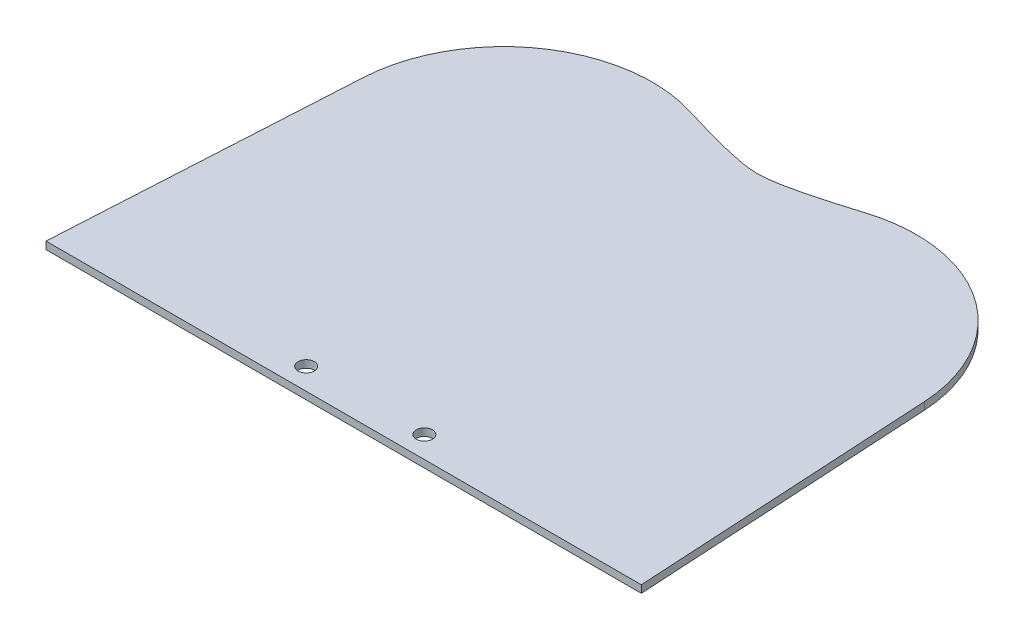
ISO-10303-21;
HEADER;
FILE_DESCRIPTION(('STEP AP214'),'2;1');
FILE_NAME('part.step','',(''),(''),'','','');
FILE_SCHEMA(('AUTOMOTIVE_DESIGN { 1 0 10303 214 1 1 1 1 }'));
ENDSEC;
DATA;
#1=APPLICATION_CONTEXT('core data for automotive mechanical design processes');
#2=APPLICATION_PROTOCOL_DEFINITION('international standard','automotive_design',2000,#1);
#3=PRODUCT_CONTEXT('',#1,'mechanical');
#4=PRODUCT('Part','Part','',(#3));
#5=PRODUCT_RELATED_PRODUCT_CATEGORY('part','',(#4));
#6=PRODUCT_DEFINITION_FORMATION('','',#4);
#7=PRODUCT_DEFINITION_CONTEXT('part definition',#1,'design');
#8=PRODUCT_DEFINITION('design','',#6,#7);
#9=PRODUCT_DEFINITION_SHAPE('','',#8);
#10=(LENGTH_UNIT() NAMED_UNIT(*) SI_UNIT(.MILLI.,.METRE.));
#11=(NAMED_UNIT(*) PLANE_ANGLE_UNIT() SI_UNIT($,.RADIAN.));
#12=(NAMED_UNIT(*) SI_UNIT($,.STERADIAN.) SOLID_ANGLE_UNIT());
#13=UNCERTAINTY_MEASURE_WITH_UNIT(LENGTH_MEASURE(1.E-05),#10,'distance_accuracy_value','');
#14=(GEOMETRIC_REPRESENTATION_CONTEXT(3) GLOBAL_UNCERTAINTY_ASSIGNED_CONTEXT((#13)) GLOBAL_UNIT_ASSIGNED_CONTEXT((#10,
#11,#12)) REPRESENTATION_CONTEXT('',''));
#15=CARTESIAN_POINT('',(0.,0.,0.));
#16=DIRECTION('',(0.,0.,1.));
#17=DIRECTION('',(1.,0.,0.));
#18=AXIS2_PLACEMENT_3D('',#15,#16,#17);
#19=CARTESIAN_POINT('',(0.,2.,0.));
#20=DIRECTION('',(0.,0.,-1.));
#21=DIRECTION('',(-1.,0.,0.));
#22=AXIS2_PLACEMENT_3D('',#19,#20,#21);
#23=PLANE('',#22);
#24=DIRECTION('',(1.,0.,0.));
#25=VECTOR('',#24,1.);
#26=CARTESIAN_POINT('',(0.,0.,0.));
#27=LINE('',#26,#25);
#28=CARTESIAN_POINT('',(0.,0.,0.));
#29=VERTEX_POINT('',#28);
#30=CARTESIAN_POINT('',(160.,0.,0.));
#31=VERTEX_POINT('',#30);
#32=EDGE_CURVE('E100',#29,#31,#27,.T.);
#33=ORIENTED_EDGE('',*,*,#32,.T.);
#34=DIRECTION('',(0.,-1.,0.));
#35=VECTOR('',#34,1.);
#36=CARTESIAN_POINT('',(160.,2.,0.));
#37=LINE('',#36,#35);
#38=CARTESIAN_POINT('',(160.,2.,0.));
#39=VERTEX_POINT('',#38);
#40=EDGE_CURVE('E41',#39,#31,#37,.T.);
#41=ORIENTED_EDGE('',*,*,#40,.F.);
#42=DIRECTION('',(1.,0.,0.));
#43=VECTOR('',#42,1.);
#44=CARTESIAN_POINT('',(0.,2.,0.));
#45=LINE('',#44,#43);
#46=CARTESIAN_POINT('',(0.,2.,0.));
#47=VERTEX_POINT('',#46);
#48=EDGE_CURVE('E106',#47,#39,#45,.T.);
#49=ORIENTED_EDGE('',*,*,#48,.F.);
#50=DIRECTION('',(0.,-1.,0.));
#51=VECTOR('',#50,1.);
#52=CARTESIAN_POINT('',(0.,2.,0.));
#53=LINE('',#52,#51);
#54=EDGE_CURVE('E11',#47,#29,#53,.T.);
#55=ORIENTED_EDGE('',*,*,#54,.T.);
#56=EDGE_LOOP('',(#33,#41,#49,#55));
#57=FACE_BOUND('',#56,.T.);
#58=ADVANCED_FACE('F34',(#57),#23,.F.);
#59=CARTESIAN_POINT('',(0.,2.,0.));
#60=DIRECTION('',(0.,-1.,0.));
#61=DIRECTION('',(0.,0.,-1.));
#62=AXIS2_PLACEMENT_3D('',#59,#60,#61);
#63=PLANE('',#62);
#64=CARTESIAN_POINT('',(64.12,2.,-5.81));
#65=DIRECTION('',(0.,1.,0.));
#66=DIRECTION('',(0.,0.,1.));
#67=AXIS2_PLACEMENT_3D('',#64,#65,#66);
#68=CIRCLE('',#67,2.185);
#69=CARTESIAN_POINT('',(64.12,2.,-3.625));
#70=VERTEX_POINT('',#69);
#71=EDGE_CURVE('E121',#70,#70,#68,.T.);
#72=ORIENTED_EDGE('',*,*,#71,.F.);
#73=EDGE_LOOP('',(#72));
#74=FACE_BOUND('',#73,.T.);
#75=CARTESIAN_POINT('',(95.87,2.,-5.81));
#76=DIRECTION('',(0.,1.,0.));
#77=DIRECTION('',(0.,0.,1.));
#78=AXIS2_PLACEMENT_3D('',#75,#76,#77);
#79=CIRCLE('',#78,2.185);
#80=CARTESIAN_POINT('',(95.87,2.,-3.625));
#81=VERTEX_POINT('',#80);
#82=EDGE_CURVE('E115',#81,#81,#79,.T.);
#83=ORIENTED_EDGE('',*,*,#82,.F.);
#84=EDGE_LOOP('',(#83));
#85=FACE_BOUND('',#84,.T.);
#86=CARTESIAN_POINT('',(44.5206222699094,2.,-78.48676821735));
#87=DIRECTION('',(0.,-1.,0.));
#88=DIRECTION('',(0.,0.,-1.));
#89=AXIS2_PLACEMENT_3D('',#86,#87,#88);
#90=CIRCLE('',#89,40.);
#91=CARTESIAN_POINT('',(4.58493819976732,2.,-80.7541759552303));
#92=VERTEX_POINT('',#91);
#93=CARTESIAN_POINT('',(56.3933458143429,2.,-116.684129849241));
#94=VERTEX_POINT('',#93);
#95=EDGE_CURVE('E252',#92,#94,#90,.T.);
#96=ORIENTED_EDGE('',*,*,#95,.F.);
#97=DIRECTION('',(0.0566851934470067,0.,-0.998392101753552));
#98=VECTOR('',#97,1.);
#99=CARTESIAN_POINT('',(0.,2.,0.));
#100=LINE('',#99,#98);
#101=EDGE_CURVE('E258',#47,#92,#100,.T.);
#102=ORIENTED_EDGE('',*,*,#101,.F.);
#103=ORIENTED_EDGE('',*,*,#48,.T.);
#104=DIRECTION('',(0.0566851934470067,0.,0.998392101753552));
#105=VECTOR('',#104,1.);
#106=CARTESIAN_POINT('',(160.,2.,0.));
#107=LINE('',#106,#105);
#108=CARTESIAN_POINT('',(155.415061800233,2.,-80.7541759552303));
#109=VERTEX_POINT('',#108);
#110=EDGE_CURVE('E53',#109,#39,#107,.T.);
#111=ORIENTED_EDGE('',*,*,#110,.F.);
#112=CARTESIAN_POINT('',(115.479377730091,2.,-78.48676821735));
#113=DIRECTION('',(0.,-1.,0.));
#114=DIRECTION('',(0.,0.,1.));
#115=AXIS2_PLACEMENT_3D('',#112,#113,#114);
#116=CIRCLE('',#115,40.);
#117=CARTESIAN_POINT('',(103.606654185657,2.,-116.684129849241));
#118=VERTEX_POINT('',#117);
#119=EDGE_CURVE('E231',#118,#109,#116,.T.);
#120=ORIENTED_EDGE('',*,*,#119,.F.);
#121=CARTESIAN_POINT('',(80.,2.,-111.276722040985));
#122=CARTESIAN_POINT('',(86.2097434625132,2.,-111.276722040985));
#123=CARTESIAN_POINT('',(103.606654185657,2.,-116.684129849241));
#124=B_SPLINE_CURVE_WITH_KNOTS('',2,(#121,#122,#123),.UNSPECIFIED.,.F.,.F.,(3,3),(0.,1.),.UNSPECIFIED.);
#125=CARTESIAN_POINT('',(80.,2.,-111.276722040985));
#126=VERTEX_POINT('',#125);
#127=EDGE_CURVE('E236',#126,#118,#124,.T.);
#128=ORIENTED_EDGE('',*,*,#127,.F.);
#129=CARTESIAN_POINT('',(56.3933458143429,2.,-116.684129849241));
#130=CARTESIAN_POINT('',(73.7902565374868,2.,-111.276722040985));
#131=CARTESIAN_POINT('',(80.,2.,-111.276722040985));
#132=B_SPLINE_CURVE_WITH_KNOTS('',2,(#129,#130,#131),.UNSPECIFIED.,.F.,.F.,(3,3),(0.,1.),.UNSPECIFIED.);
#133=EDGE_CURVE('E244',#94,#126,#132,.T.);
#134=ORIENTED_EDGE('',*,*,#133,.F.);
#135=EDGE_LOOP('',(#96,#102,#103,#111,#120,#128,#134));
#136=FACE_BOUND('',#135,.T.);
#137=ADVANCED_FACE('F157',(#74,#85,#136),#63,.F.);
#138=CARTESIAN_POINT('',(0.,0.,0.));
#139=DIRECTION('',(0.,-1.,0.));
#140=DIRECTION('',(0.,0.,-1.));
#141=AXIS2_PLACEMENT_3D('',#138,#139,#140);
#142=PLANE('',#141);
#143=DIRECTION('',(0.0566851934470067,0.,-0.998392101753552));
#144=VECTOR('',#143,1.);
#145=CARTESIAN_POINT('',(0.,0.,0.));
#146=LINE('',#145,#144);
#147=CARTESIAN_POINT('',(4.58493819976732,0.,-80.7541759552303));
#148=VERTEX_POINT('',#147);
#149=EDGE_CURVE('E90',#29,#148,#146,.T.);
#150=ORIENTED_EDGE('',*,*,#149,.T.);
#151=CARTESIAN_POINT('',(44.5206222699094,0.,-78.48676821735));
#152=DIRECTION('',(0.,-1.,0.));
#153=DIRECTION('',(0.,0.,-1.));
#154=AXIS2_PLACEMENT_3D('',#151,#152,#153);
#155=CIRCLE('',#154,40.);
#156=CARTESIAN_POINT('',(56.3933458143429,0.,-116.684129849241));
#157=VERTEX_POINT('',#156);
#158=EDGE_CURVE('E277',#148,#157,#155,.T.);
#159=ORIENTED_EDGE('',*,*,#158,.T.);
#160=CARTESIAN_POINT('',(56.3933458143429,0.,-116.684129849241));
#161=CARTESIAN_POINT('',(73.7902565374868,0.,-111.276722040985));
#162=CARTESIAN_POINT('',(80.,0.,-111.276722040985));
#163=B_SPLINE_CURVE_WITH_KNOTS('',2,(#160,#161,#162),.UNSPECIFIED.,.F.,.F.,(3,3),(0.,1.),.UNSPECIFIED.);
#164=CARTESIAN_POINT('',(80.,0.,-111.276722040985));
#165=VERTEX_POINT('',#164);
#166=EDGE_CURVE('E268',#157,#165,#163,.T.);
#167=ORIENTED_EDGE('',*,*,#166,.T.);
#168=CARTESIAN_POINT('',(80.,0.,-111.276722040985));
#169=CARTESIAN_POINT('',(86.2097434625132,0.,-111.276722040985));
#170=CARTESIAN_POINT('',(103.606654185657,0.,-116.684129849241));
#171=B_SPLINE_CURVE_WITH_KNOTS('',2,(#168,#169,#170),.UNSPECIFIED.,.F.,.F.,(3,3),(0.,1.),.UNSPECIFIED.);
#172=CARTESIAN_POINT('',(103.606654185657,0.,-116.684129849241));
#173=VERTEX_POINT('',#172);
#174=EDGE_CURVE('E262',#165,#173,#171,.T.);
#175=ORIENTED_EDGE('',*,*,#174,.T.);
#176=CARTESIAN_POINT('',(115.479377730091,0.,-78.48676821735));
#177=DIRECTION('',(0.,-1.,0.));
#178=DIRECTION('',(0.,0.,-1.));
#179=AXIS2_PLACEMENT_3D('',#176,#177,#178);
#180=CIRCLE('',#179,40.);
#181=CARTESIAN_POINT('',(155.415061800233,0.,-80.7541759552303));
#182=VERTEX_POINT('',#181);
#183=EDGE_CURVE('E228',#173,#182,#180,.T.);
#184=ORIENTED_EDGE('',*,*,#183,.T.);
#185=DIRECTION('',(0.0566851934470067,0.,0.998392101753552));
#186=VECTOR('',#185,1.);
#187=CARTESIAN_POINT('',(160.,0.,0.));
#188=LINE('',#187,#186);
#189=EDGE_CURVE('E104',#182,#31,#188,.T.);
#190=ORIENTED_EDGE('',*,*,#189,.T.);
#191=ORIENTED_EDGE('',*,*,#32,.F.);
#192=EDGE_LOOP('',(#150,#159,#167,#175,#184,#190,#191));
#193=FACE_BOUND('',#192,.T.);
#194=CARTESIAN_POINT('',(64.12,0.,-5.81));
#195=DIRECTION('',(0.,-1.,0.));
#196=DIRECTION('',(0.,0.,-1.));
#197=AXIS2_PLACEMENT_3D('',#194,#195,#196);
#198=CIRCLE('',#197,2.185);
#199=CARTESIAN_POINT('',(64.12,0.,-7.99499999999999));
#200=VERTEX_POINT('',#199);
#201=EDGE_CURVE('E118',#200,#200,#198,.F.);
#202=ORIENTED_EDGE('',*,*,#201,.T.);
#203=EDGE_LOOP('',(#202));
#204=FACE_BOUND('',#203,.T.);
#205=CARTESIAN_POINT('',(95.87,0.,-5.81));
#206=DIRECTION('',(0.,-1.,0.));
#207=DIRECTION('',(0.,0.,-1.));
#208=AXIS2_PLACEMENT_3D('',#205,#206,#207);
#209=CIRCLE('',#208,2.185);
#210=CARTESIAN_POINT('',(95.87,0.,-7.99499999999999));
#211=VERTEX_POINT('',#210);
#212=EDGE_CURVE('E107',#211,#211,#209,.F.);
#213=ORIENTED_EDGE('',*,*,#212,.T.);
#214=EDGE_LOOP('',(#213));
#215=FACE_BOUND('',#214,.T.);
#216=ADVANCED_FACE('F101',(#193,#204,#215),#142,.T.);
#217=CARTESIAN_POINT('',(95.87,-6.18011326757041,-5.81));
#218=DIRECTION('',(0.,1.,0.));
#219=DIRECTION('',(0.,0.,1.));
#220=AXIS2_PLACEMENT_3D('',#217,#218,#219);
#221=CYLINDRICAL_SURFACE('',#220,2.185);
#222=ORIENTED_EDGE('',*,*,#82,.T.);
#223=EDGE_LOOP('',(#222));
#224=FACE_BOUND('',#223,.T.);
#225=ORIENTED_EDGE('',*,*,#212,.F.);
#226=EDGE_LOOP('',(#225));
#227=FACE_BOUND('',#226,.T.);
#228=ADVANCED_FACE('F152',(#224,#227),#221,.F.);
#229=CARTESIAN_POINT('',(64.12,-6.18011326757041,-5.81));
#230=DIRECTION('',(0.,1.,0.));
#231=DIRECTION('',(0.,0.,1.));
#232=AXIS2_PLACEMENT_3D('',#229,#230,#231);
#233=CYLINDRICAL_SURFACE('',#232,2.185);
#234=ORIENTED_EDGE('',*,*,#71,.T.);
#235=EDGE_LOOP('',(#234));
#236=FACE_BOUND('',#235,.T.);
#237=ORIENTED_EDGE('',*,*,#201,.F.);
#238=EDGE_LOOP('',(#237));
#239=FACE_BOUND('',#238,.T.);
#240=ADVANCED_FACE('F149',(#236,#239),#233,.F.);
#241=CARTESIAN_POINT('',(0.,-209.220997100423,0.));
#242=DIRECTION('',(0.998392101753552,0.,0.0566851934470067));
#243=DIRECTION('',(0.0566851934470067,0.,-0.998392101753552));
#244=AXIS2_PLACEMENT_3D('',#241,#242,#243);
#245=PLANE('',#244);
#246=ORIENTED_EDGE('',*,*,#54,.F.);
#247=ORIENTED_EDGE('',*,*,#101,.T.);
#248=DIRECTION('',(0.,1.,0.));
#249=VECTOR('',#248,1.);
#250=CARTESIAN_POINT('',(4.58493819976732,-209.220997100423,-80.7541759552303));
#251=LINE('',#250,#249);
#252=EDGE_CURVE('E95',#148,#92,#251,.T.);
#253=ORIENTED_EDGE('',*,*,#252,.F.);
#254=ORIENTED_EDGE('',*,*,#149,.F.);
#255=EDGE_LOOP('',(#246,#247,#253,#254));
#256=FACE_BOUND('',#255,.T.);
#257=ADVANCED_FACE('F92',(#256),#245,.F.);
#258=CARTESIAN_POINT('',(44.5206222699094,-209.220997100423,-78.48676821735));
#259=DIRECTION('',(0.,1.,0.));
#260=DIRECTION('',(0.,0.,1.));
#261=AXIS2_PLACEMENT_3D('',#258,#259,#260);
#262=CYLINDRICAL_SURFACE('',#261,40.);
#263=ORIENTED_EDGE('',*,*,#252,.T.);
#264=ORIENTED_EDGE('',*,*,#95,.T.);
#265=DIRECTION('',(0.,1.,0.));
#266=VECTOR('',#265,1.);
#267=CARTESIAN_POINT('',(56.3933458143429,-209.220997100423,-116.684129849241));
#268=LINE('',#267,#266);
#269=EDGE_CURVE('E276',#157,#94,#268,.T.);
#270=ORIENTED_EDGE('',*,*,#269,.F.);
#271=ORIENTED_EDGE('',*,*,#158,.F.);
#272=EDGE_LOOP('',(#263,#264,#270,#271));
#273=FACE_BOUND('',#272,.T.);
#274=ADVANCED_FACE('F141',(#273),#262,.T.);
#275=CARTESIAN_POINT('',(56.3933458143429,-209.220997100423,-116.684129849241));
#276=CARTESIAN_POINT('',(73.7902565374868,-209.220997100423,-111.276722040985));
#277=CARTESIAN_POINT('',(80.,-209.220997100423,-111.276722040985));
#278=B_SPLINE_CURVE_WITH_KNOTS('',2,(#275,#276,#277),.UNSPECIFIED.,.F.,.F.,(3,3),(0.,1.),.UNSPECIFIED.);
#279=DIRECTION('',(0.,1.,0.));
#280=VECTOR('',#279,1.);
#281=SURFACE_OF_LINEAR_EXTRUSION('',#278,#280);
#282=ORIENTED_EDGE('',*,*,#269,.T.);
#283=ORIENTED_EDGE('',*,*,#133,.T.);
#284=DIRECTION('',(0.,1.,0.));
#285=VECTOR('',#284,1.);
#286=CARTESIAN_POINT('',(80.,-209.220997100423,-111.276722040985));
#287=LINE('',#286,#285);
#288=EDGE_CURVE('E267',#165,#126,#287,.T.);
#289=ORIENTED_EDGE('',*,*,#288,.F.);
#290=ORIENTED_EDGE('',*,*,#166,.F.);
#291=EDGE_LOOP('',(#282,#283,#289,#290));
#292=FACE_BOUND('',#291,.T.);
#293=ADVANCED_FACE('F136',(#292),#281,.F.);
#294=CARTESIAN_POINT('',(80.,-209.220997100423,-111.276722040985));
#295=CARTESIAN_POINT('',(86.2097434625132,-209.220997100423,-111.276722040985));
#296=CARTESIAN_POINT('',(103.606654185657,-209.220997100423,-116.684129849241));
#297=B_SPLINE_CURVE_WITH_KNOTS('',2,(#294,#295,#296),.UNSPECIFIED.,.F.,.F.,(3,3),(0.,1.),.UNSPECIFIED.);
#298=DIRECTION('',(0.,1.,0.));
#299=VECTOR('',#298,1.);
#300=SURFACE_OF_LINEAR_EXTRUSION('',#297,#299);
#301=ORIENTED_EDGE('',*,*,#288,.T.);
#302=ORIENTED_EDGE('',*,*,#127,.T.);
#303=DIRECTION('',(0.,1.,0.));
#304=VECTOR('',#303,1.);
#305=CARTESIAN_POINT('',(103.606654185657,-209.220997100423,-116.684129849241));
#306=LINE('',#305,#304);
#307=EDGE_CURVE('E233',#173,#118,#306,.T.);
#308=ORIENTED_EDGE('',*,*,#307,.F.);
#309=ORIENTED_EDGE('',*,*,#174,.F.);
#310=EDGE_LOOP('',(#301,#302,#308,#309));
#311=FACE_BOUND('',#310,.T.);
#312=ADVANCED_FACE('F140',(#311),#300,.F.);
#313=CARTESIAN_POINT('',(115.479377730091,-209.220997100423,-78.48676821735));
#314=DIRECTION('',(0.,1.,0.));
#315=DIRECTION('',(0.,0.,1.));
#316=AXIS2_PLACEMENT_3D('',#313,#314,#315);
#317=CYLINDRICAL_SURFACE('',#316,40.);
#318=ORIENTED_EDGE('',*,*,#307,.T.);
#319=ORIENTED_EDGE('',*,*,#119,.T.);
#320=DIRECTION('',(0.,1.,0.));
#321=VECTOR('',#320,1.);
#322=CARTESIAN_POINT('',(155.415061800233,-209.220997100423,-80.7541759552303));
#323=LINE('',#322,#321);
#324=EDGE_CURVE('E226',#182,#109,#323,.T.);
#325=ORIENTED_EDGE('',*,*,#324,.F.);
#326=ORIENTED_EDGE('',*,*,#183,.F.);
#327=EDGE_LOOP('',(#318,#319,#325,#326));
#328=FACE_BOUND('',#327,.T.);
#329=ADVANCED_FACE('F204',(#328),#317,.T.);
#330=CARTESIAN_POINT('',(160.,-209.220997100423,0.));
#331=DIRECTION('',(-0.998392101753552,0.,0.0566851934470067));
#332=DIRECTION('',(0.0566851934470067,0.,0.998392101753552));
#333=AXIS2_PLACEMENT_3D('',#330,#331,#332);
#334=PLANE('',#333);
#335=ORIENTED_EDGE('',*,*,#324,.T.);
#336=ORIENTED_EDGE('',*,*,#110,.T.);
#337=ORIENTED_EDGE('',*,*,#40,.T.);
#338=ORIENTED_EDGE('',*,*,#189,.F.);
#339=EDGE_LOOP('',(#335,#336,#337,#338));
#340=FACE_BOUND('',#339,.T.);
#341=ADVANCED_FACE('F213',(#340),#334,.F.);
#342=CLOSED_SHELL('',(#58,#137,#216,#228,#240,#257,#274,#293,#312,#329,#341));
#343=MANIFOLD_SOLID_BREP('B2',#342);
#344=ADVANCED_BREP_SHAPE_REPRESENTATION('',(#18,#343),#14);
#345=SHAPE_DEFINITION_REPRESENTATION(#9,#344);
ENDSEC;
END-ISO-10303-21;
